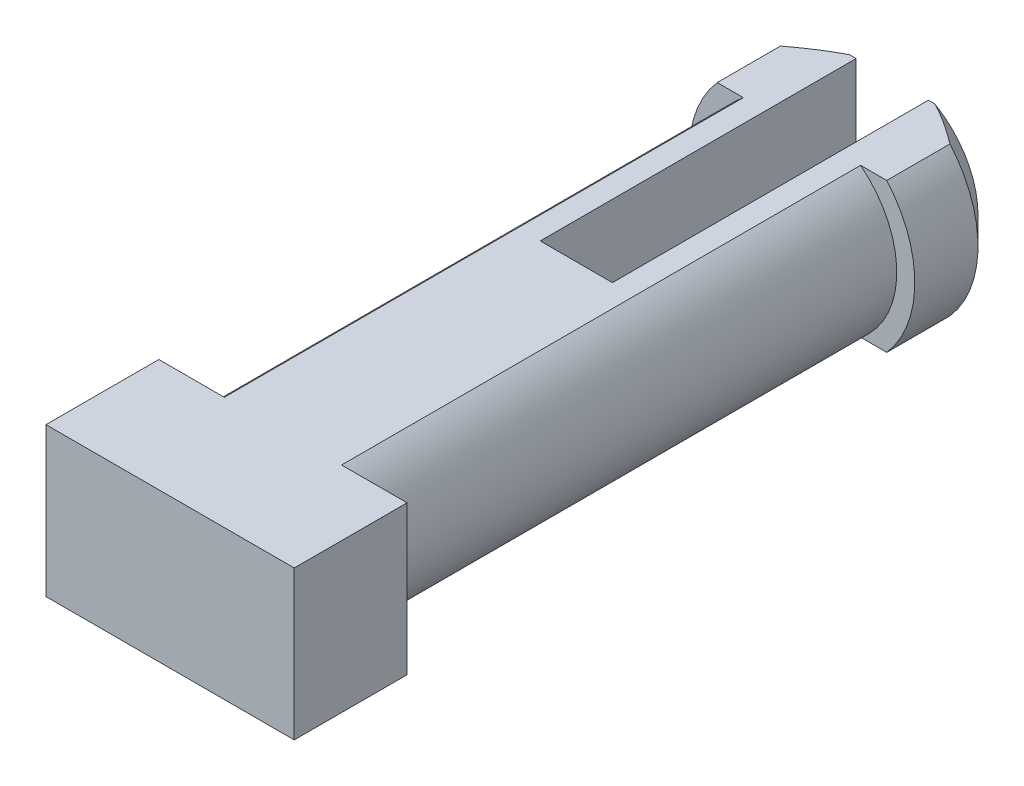
ISO-10303-21;
HEADER;
FILE_DESCRIPTION(('STEP AP214'),'2;1');
FILE_NAME('part.step','',(''),(''),'','','');
FILE_SCHEMA(('AUTOMOTIVE_DESIGN { 1 0 10303 214 1 1 1 1 }'));
ENDSEC;
DATA;
#1=APPLICATION_CONTEXT('core data for automotive mechanical design processes');
#2=APPLICATION_PROTOCOL_DEFINITION('international standard','automotive_design',2000,#1);
#3=PRODUCT_CONTEXT('',#1,'mechanical');
#4=PRODUCT('Part','Part','',(#3));
#5=PRODUCT_RELATED_PRODUCT_CATEGORY('part','',(#4));
#6=PRODUCT_DEFINITION_FORMATION('','',#4);
#7=PRODUCT_DEFINITION_CONTEXT('part definition',#1,'design');
#8=PRODUCT_DEFINITION('design','',#6,#7);
#9=PRODUCT_DEFINITION_SHAPE('','',#8);
#10=(LENGTH_UNIT() NAMED_UNIT(*) SI_UNIT(.MILLI.,.METRE.));
#11=(NAMED_UNIT(*) PLANE_ANGLE_UNIT() SI_UNIT($,.RADIAN.));
#12=(NAMED_UNIT(*) SI_UNIT($,.STERADIAN.) SOLID_ANGLE_UNIT());
#13=UNCERTAINTY_MEASURE_WITH_UNIT(LENGTH_MEASURE(1.E-05),#10,'distance_accuracy_value','');
#14=(GEOMETRIC_REPRESENTATION_CONTEXT(3) GLOBAL_UNCERTAINTY_ASSIGNED_CONTEXT((#13)) GLOBAL_UNIT_ASSIGNED_CONTEXT((#10,
#11,#12)) REPRESENTATION_CONTEXT('',''));
#15=CARTESIAN_POINT('',(0.,0.,0.));
#16=DIRECTION('',(0.,0.,1.));
#17=DIRECTION('',(1.,0.,0.));
#18=AXIS2_PLACEMENT_3D('',#15,#16,#17);
#19=CARTESIAN_POINT('',(-76.2353071822368,0.117725091031173,-31.5989637783194));
#20=DIRECTION('',(-1.,0.,0.));
#21=DIRECTION('',(0.,0.,1.));
#22=AXIS2_PLACEMENT_3D('',#19,#20,#21);
#23=PLANE('',#22);
#24=DIRECTION('',(0.,0.,1.));
#25=VECTOR('',#24,1.);
#26=CARTESIAN_POINT('',(-76.2353071822368,-0.572274908968824,-32.4989637783194));
#27=LINE('',#26,#25);
#28=CARTESIAN_POINT('',(-76.2353071822368,-0.572274908968825,-30.5389637783194));
#29=VERTEX_POINT('',#28);
#30=CARTESIAN_POINT('',(-76.2353071822368,-0.572274908968825,-23.5389637783194));
#31=VERTEX_POINT('',#30);
#32=EDGE_CURVE('E160',#29,#31,#27,.T.);
#33=ORIENTED_EDGE('',*,*,#32,.F.);
#34=DIRECTION('',(0.,1.,0.));
#35=VECTOR('',#34,1.);
#36=CARTESIAN_POINT('',(-76.2353071822368,-4.56227490896883,-30.5389637783194));
#37=LINE('',#36,#35);
#38=CARTESIAN_POINT('',(-76.2353071822368,-3.87227490896883,-30.5389637783194));
#39=VERTEX_POINT('',#38);
#40=EDGE_CURVE('E111',#39,#29,#37,.T.);
#41=ORIENTED_EDGE('',*,*,#40,.F.);
#42=DIRECTION('',(0.,0.,-1.));
#43=VECTOR('',#42,1.);
#44=CARTESIAN_POINT('',(-76.2353071822368,-3.87227490896883,-12.5789637783194));
#45=LINE('',#44,#43);
#46=CARTESIAN_POINT('',(-76.2353071822368,-3.87227490896883,-23.5389637783194));
#47=VERTEX_POINT('',#46);
#48=EDGE_CURVE('E224',#47,#39,#45,.T.);
#49=ORIENTED_EDGE('',*,*,#48,.F.);
#50=DIRECTION('',(0.,1.,0.));
#51=VECTOR('',#50,1.);
#52=CARTESIAN_POINT('',(-76.2353071822368,-4.56227490896883,-23.5389637783194));
#53=LINE('',#52,#51);
#54=EDGE_CURVE('E161',#31,#47,#53,.F.);
#55=ORIENTED_EDGE('',*,*,#54,.F.);
#56=EDGE_LOOP('',(#33,#41,#49,#55));
#57=FACE_BOUND('',#56,.T.);
#58=ADVANCED_FACE('F14',(#57),#23,.T.);
#59=CARTESIAN_POINT('',(-74.6653071822367,-4.56227490896883,-30.5389637783194));
#60=DIRECTION('',(0.,0.,-1.));
#61=DIRECTION('',(-1.,0.,0.));
#62=AXIS2_PLACEMENT_3D('',#59,#60,#61);
#63=PLANE('',#62);
#64=CARTESIAN_POINT('',(-76.0932349981659,-3.87227490896881,-30.5389637783194));
#65=CARTESIAN_POINT('',(-76.0468133293684,-3.84577094009665,-30.5389637783194));
#66=CARTESIAN_POINT('',(-76.0015318151991,-3.81731780875696,-30.5389637783194));
#67=CARTESIAN_POINT('',(-75.9135295388419,-3.75670340526783,-30.5389637783194));
#68=CARTESIAN_POINT('',(-75.870808516365,-3.72454251100924,-30.5389637783194));
#69=CARTESIAN_POINT('',(-75.7470230966809,-3.62288161568403,-30.5389637783194));
#70=CARTESIAN_POINT('',(-75.6701883036997,-3.54811866477146,-30.5389637783194));
#71=CARTESIAN_POINT('',(-75.5301420883078,-3.38670622232277,-30.5389637783194));
#72=CARTESIAN_POINT('',(-75.4669370356522,-3.3000512039427,-30.5389637783194));
#73=CARTESIAN_POINT('',(-75.3837616882182,-3.16315586717694,-30.5389637783194));
#74=CARTESIAN_POINT('',(-75.3579730666862,-3.11636639022587,-30.5389637783194));
#75=CARTESIAN_POINT('',(-75.3103987475018,-3.02073937405032,-30.5389637783194));
#76=CARTESIAN_POINT('',(-75.2886168659895,-2.97189993618704,-30.5389637783194));
#77=CARTESIAN_POINT('',(-75.2296000223762,-2.82294595944435,-30.5389637783194));
#78=CARTESIAN_POINT('',(-75.1986211410463,-2.72027580101289,-30.5389637783194));
#79=CARTESIAN_POINT('',(-75.1543623895121,-2.51117997230449,-30.5389637783194));
#80=CARTESIAN_POINT('',(-75.141083625662,-2.4047540676996,-30.5389637783194));
#81=CARTESIAN_POINT('',(-75.1346842083401,-2.24464346847721,-30.5389637783194));
#82=CARTESIAN_POINT('',(-75.1348094733314,-2.19115354372823,-30.5389637783194));
#83=CARTESIAN_POINT('',(-75.1395634106559,-2.08442694526944,-30.5389637783194));
#84=CARTESIAN_POINT('',(-75.1441866083597,-2.03119004274606,-30.5389637783194));
#85=CARTESIAN_POINT('',(-75.1579002357707,-1.92530206501404,-30.5389637783194));
#86=CARTESIAN_POINT('',(-75.1669900634881,-1.87265091183872,-30.5389637783194));
#87=CARTESIAN_POINT('',(-75.189577284845,-1.76824800295876,-30.5389637783194));
#88=CARTESIAN_POINT('',(-75.2030800508211,-1.71649742490929,-30.5389637783194));
#89=CARTESIAN_POINT('',(-75.2500512987537,-1.56330318814526,-30.5389637783194));
#90=CARTESIAN_POINT('',(-75.2900020741934,-1.463768784372,-30.5389637783194));
#91=CARTESIAN_POINT('',(-75.3860651518974,-1.27284376145886,-30.5389637783194));
#92=CARTESIAN_POINT('',(-75.4421757860486,-1.18145230303185,-30.5389637783194));
#93=CARTESIAN_POINT('',(-75.5372130189646,-1.052409262237,-30.5389637783194));
#94=CARTESIAN_POINT('',(-75.5707476911757,-1.01069337095264,-30.5389637783194));
#95=CARTESIAN_POINT('',(-75.6411959568207,-0.930258687226402,-30.5389637783194));
#96=CARTESIAN_POINT('',(-75.6781068701636,-0.891537561811588,-30.5389637783194));
#97=CARTESIAN_POINT('',(-75.7550092548121,-0.817394768855837,-30.5389637783194));
#98=CARTESIAN_POINT('',(-75.7949968127061,-0.781969032406077,-30.5389637783194));
#99=CARTESIAN_POINT('',(-75.8778040905174,-0.714616978685832,-30.5389637783194));
#100=CARTESIAN_POINT('',(-75.9206227879884,-0.68268940902575,-30.5389637783194));
#101=CARTESIAN_POINT('',(-75.9855906565279,-0.638376064807736,-30.5389637783194));
#102=CARTESIAN_POINT('',(-76.0067664237344,-0.624544131239821,-30.5389637783194));
#103=CARTESIAN_POINT('',(-76.0496228586669,-0.597755336286038,-30.5389637783194));
#104=CARTESIAN_POINT('',(-76.0713027715575,-0.584797267324398,-30.5389637783194));
#105=CARTESIAN_POINT('',(-76.0932349981659,-0.572274908968873,-30.5389637783194));
#106=B_SPLINE_CURVE_WITH_KNOTS('',3,(#64,#65,#66,#67,#68,#69,#70,#71,#72,#73,#74,#75,#76,#77,
#78,#79,#80,#81,#82,#83,#84,#85,#86,#87,#88,#89,#90,#91,#92,#93,#94,#95,#96,#97,#98,#99,#100,
#101,#102,#103,#104,#105),.UNSPECIFIED.,.F.,.F.,(4,2,2,2,2,2,2,2,2,2,2,2,2,2,2,2,2,2,2,2,4),(0.,
0.160270194330243,0.320524068526389,0.640526652391439,0.960678464461189,1.12078982801574,
1.28105290569564,1.60116363852675,1.92129437909333,2.0816052163079,2.24172117603199,
2.40181556206345,2.5621055785037,2.88224283248226,3.20234705189767,3.36275922013168,
3.5230451388629,3.68313044553553,3.8431582509936,3.91902017095026,3.99477501460227),.UNSPECIFIED.);
#107=CARTESIAN_POINT('',(-76.0932349981659,-3.87227490896882,-30.5389637783194));
#108=VERTEX_POINT('',#107);
#109=CARTESIAN_POINT('',(-76.0932349981659,-0.572274908968842,-30.5389637783194));
#110=VERTEX_POINT('',#109);
#111=EDGE_CURVE('E18',#108,#110,#106,.T.);
#112=ORIENTED_EDGE('',*,*,#111,.F.);
#113=DIRECTION('',(1.,0.,0.));
#114=VECTOR('',#113,1.);
#115=CARTESIAN_POINT('',(-80.6953071822368,-3.87227490896883,-30.5389637783194));
#116=LINE('',#115,#114);
#117=EDGE_CURVE('E227',#39,#108,#116,.T.);
#118=ORIENTED_EDGE('',*,*,#117,.F.);
#119=ORIENTED_EDGE('',*,*,#40,.T.);
#120=DIRECTION('',(1.,0.,0.));
#121=VECTOR('',#120,1.);
#122=CARTESIAN_POINT('',(-80.6953071822368,-0.572274908968824,-30.5389637783194));
#123=LINE('',#122,#121);
#124=EDGE_CURVE('E340',#110,#29,#123,.F.);
#125=ORIENTED_EDGE('',*,*,#124,.F.);
#126=EDGE_LOOP('',(#112,#118,#119,#125));
#127=FACE_BOUND('',#126,.T.);
#128=ADVANCED_FACE('F355',(#127),#63,.T.);
#129=CARTESIAN_POINT('',(-77.0353071822368,-2.22227490896883,-32.4389637783194));
#130=CARTESIAN_POINT('',(-77.0353071822368,-4.97347490896883,-29.6877637783194));
#131=CARTESIAN_POINT('',(-77.0353071822368,-2.22227490896883,-32.4389637783194));
#132=CARTESIAN_POINT('',(-74.2841071822368,-4.97347490896883,-29.6877637783194));
#133=CARTESIAN_POINT('',(-77.0353071822368,-2.22227490896883,-32.4389637783194));
#134=CARTESIAN_POINT('',(-74.2841071822368,-2.22227490896883,-29.6877637783194));
#135=CARTESIAN_POINT('',(-77.0353071822368,-2.22227490896883,-32.4389637783194));
#136=CARTESIAN_POINT('',(-74.2841071822368,0.528925091031176,-29.6877637783194));
#137=CARTESIAN_POINT('',(-77.0353071822368,-2.22227490896883,-32.4389637783194));
#138=CARTESIAN_POINT('',(-77.0353071822368,0.528925091031176,-29.6877637783194));
#139=CARTESIAN_POINT('',(-77.0353071822368,-2.22227490896883,-32.4389637783194));
#140=CARTESIAN_POINT('',(-79.7865071822368,0.528925091031176,-29.6877637783194));
#141=CARTESIAN_POINT('',(-77.0353071822368,-2.22227490896883,-32.4389637783194));
#142=CARTESIAN_POINT('',(-79.7865071822368,-2.22227490896883,-29.6877637783194));
#143=CARTESIAN_POINT('',(-77.0353071822368,-2.22227490896883,-32.4389637783194));
#144=CARTESIAN_POINT('',(-79.7865071822368,-4.97347490896883,-29.6877637783194));
#145=CARTESIAN_POINT('',(-77.0353071822368,-2.22227490896883,-32.4389637783194));
#146=CARTESIAN_POINT('',(-77.0353071822368,-4.97347490896883,-29.6877637783194));
#147=(BOUNDED_SURFACE() B_SPLINE_SURFACE(2,1,((#129,#130),(#131,#132),(#133,#134),(#135,#136),
(#137,#138),(#139,#140),(#141,#142),(#143,#144),(#145,#146)),.UNSPECIFIED.,.T.,.F.,
.F.) B_SPLINE_SURFACE_WITH_KNOTS((3,2,2,2,3),(2,2),(0.,1.5707963267949,3.14159265358979,
4.71238898038469,6.28318530717959),(0.,3.89078435280086),
.UNSPECIFIED.) GEOMETRIC_REPRESENTATION_ITEM() RATIONAL_B_SPLINE_SURFACE(((1.,1.),
(0.707106781186548,0.707106781186548),(1.,1.),(0.707106781186548,0.707106781186548),(1.,1.),
(0.707106781186548,0.707106781186548),(1.,1.),(0.707106781186548,0.707106781186548),(1.,1.))) REPRESENTATION_ITEM('') SURFACE());
#148=CARTESIAN_POINT('',(-76.0932349981659,-3.87227490896883,-30.5389637783194));
#149=CARTESIAN_POINT('',(-76.0377126906365,-3.87227490896883,-30.511409665987));
#150=CARTESIAN_POINT('',(-75.9829251164488,-3.87227490896883,-30.4824332634278));
#151=CARTESIAN_POINT('',(-75.8747643857159,-3.87227490896883,-30.4222039002672));
#152=CARTESIAN_POINT('',(-75.8213884660292,-3.87227490896883,-30.3909559181604));
#153=CARTESIAN_POINT('',(-75.7157930936579,-3.87227490896883,-30.3266493232658));
#154=CARTESIAN_POINT('',(-75.6635729583095,-3.87227490896883,-30.2935918216446));
#155=CARTESIAN_POINT('',(-75.560123205388,-3.87227490896883,-30.2260168799878));
#156=CARTESIAN_POINT('',(-75.5088931396419,-3.87227490896883,-30.1915001241887));
#157=CARTESIAN_POINT('',(-75.4072060696457,-3.87227490896883,-30.1212367620015));
#158=CARTESIAN_POINT('',(-75.3567499504416,-3.87227490896883,-30.0854888802171));
#159=CARTESIAN_POINT('',(-75.2564757432845,-3.87227490896883,-30.0129474419106));
#160=CARTESIAN_POINT('',(-75.206658757134,-3.87227490896883,-29.9761523603329));
#161=CARTESIAN_POINT('',(-75.1571431851375,-3.87227490896883,-29.9389637783194));
#162=B_SPLINE_CURVE_WITH_KNOTS('',3,(#148,#149,#150,#151,#152,#153,#154,#155,#156,#157,#158,
#159,#160,#161),.UNSPECIFIED.,.F.,.F.,(4,2,2,2,2,2,4),(0.,0.185892598539961,0.371389403618241,
0.556773551881311,0.742071718220588,0.927567989215806,1.11334982457747),.UNSPECIFIED.);
#163=CARTESIAN_POINT('',(-75.1571431851375,-3.87227490896883,-29.9389637783194));
#164=VERTEX_POINT('',#163);
#165=EDGE_CURVE('E269',#108,#164,#162,.T.);
#166=CARTESIAN_POINT('',(-75.1571431851375,-0.572274908968823,-29.9389637783194));
#167=CARTESIAN_POINT('',(-75.206658757134,-0.572274908968824,-29.9761523603329));
#168=CARTESIAN_POINT('',(-75.2564757432844,-0.572274908968824,-30.0129474419106));
#169=CARTESIAN_POINT('',(-75.3567499504416,-0.572274908968824,-30.0854888802171));
#170=CARTESIAN_POINT('',(-75.4072060696457,-0.572274908968824,-30.1212367620015));
#171=CARTESIAN_POINT('',(-75.5088931396419,-0.572274908968824,-30.1915001241887));
#172=CARTESIAN_POINT('',(-75.5601232053879,-0.572274908968824,-30.2260168799877));
#173=CARTESIAN_POINT('',(-75.6635729583095,-0.572274908968824,-30.2935918216446));
#174=CARTESIAN_POINT('',(-75.7157930936579,-0.572274908968824,-30.3266493232658));
#175=CARTESIAN_POINT('',(-75.8213884660292,-0.572274908968824,-30.3909559181603));
#176=CARTESIAN_POINT('',(-75.8747643857158,-0.572274908968824,-30.4222039002671));
#177=CARTESIAN_POINT('',(-75.9829251164488,-0.572274908968824,-30.4824332634278));
#178=CARTESIAN_POINT('',(-76.0377126906365,-0.572274908968824,-30.511409665987));
#179=CARTESIAN_POINT('',(-76.0932349981659,-0.572274908968825,-30.5389637783193));
#180=B_SPLINE_CURVE_WITH_KNOTS('',3,(#166,#167,#168,#169,#170,#171,#172,#173,#174,#175,#176,
#177,#178,#179),.UNSPECIFIED.,.F.,.F.,(4,2,2,2,2,2,4),(0.,0.185781835361663,0.371278106356883,
0.556576272696147,0.741960420959209,0.927457226037489,1.11334982457744),.UNSPECIFIED.);
#181=CARTESIAN_POINT('',(-75.1571431851375,-0.572274908968824,-29.9389637783194));
#182=VERTEX_POINT('',#181);
#183=EDGE_CURVE('E321',#182,#110,#180,.T.);
#184=CARTESIAN_POINT('',(-77.0353071822368,-2.22227490896883,-29.9389637783194));
#185=DIRECTION('',(0.,0.,1.));
#186=DIRECTION('',(0.,-1.,0.));
#187=AXIS2_PLACEMENT_3D('',#184,#185,#186);
#188=CIRCLE('',#187,2.5);
#189=EDGE_CURVE('E220',#164,#182,#188,.T.);
#190=ORIENTED_EDGE('',*,*,#165,.F.);
#191=ORIENTED_EDGE('',*,*,#111,.T.);
#192=ORIENTED_EDGE('',*,*,#183,.F.);
#193=ORIENTED_EDGE('',*,*,#189,.F.);
#194=EDGE_LOOP('',(#190,#191,#192,#193));
#195=FACE_BOUND('',#194,.T.);
#196=ADVANCED_FACE('F349',(#195),#147,.T.);
#197=CARTESIAN_POINT('',(-77.0353071822368,-2.22227490896883,-30.0801637783194));
#198=DIRECTION('',(0.,0.,1.));
#199=DIRECTION('',(1.,0.,0.));
#200=AXIS2_PLACEMENT_3D('',#197,#198,#199);
#201=CYLINDRICAL_SURFACE('',#200,2.5);
#202=DIRECTION('',(0.,0.,1.));
#203=VECTOR('',#202,1.);
#204=CARTESIAN_POINT('',(-75.1571431851375,-0.572274908968824,-32.4989637783194));
#205=LINE('',#204,#203);
#206=CARTESIAN_POINT('',(-75.1571431851375,-0.572274908968824,-28.5389637783194));
#207=VERTEX_POINT('',#206);
#208=EDGE_CURVE('E240',#207,#182,#205,.F.);
#209=ORIENTED_EDGE('',*,*,#208,.F.);
#210=CARTESIAN_POINT('',(-77.0353071822368,-2.22227490896883,-28.5389637783194));
#211=DIRECTION('',(0.,0.,1.));
#212=DIRECTION('',(1.,0.,0.));
#213=AXIS2_PLACEMENT_3D('',#210,#211,#212);
#214=CIRCLE('',#213,2.5);
#215=CARTESIAN_POINT('',(-75.1571431851375,-3.87227490896883,-28.5389637783194));
#216=VERTEX_POINT('',#215);
#217=EDGE_CURVE('E222',#216,#207,#214,.T.);
#218=ORIENTED_EDGE('',*,*,#217,.F.);
#219=DIRECTION('',(0.,0.,-1.));
#220=VECTOR('',#219,1.);
#221=CARTESIAN_POINT('',(-75.1571431851375,-3.87227490896883,-12.5789637783194));
#222=LINE('',#221,#220);
#223=EDGE_CURVE('E219',#164,#216,#222,.F.);
#224=ORIENTED_EDGE('',*,*,#223,.F.);
#225=ORIENTED_EDGE('',*,*,#189,.T.);
#226=EDGE_LOOP('',(#209,#218,#224,#225));
#227=FACE_BOUND('',#226,.T.);
#228=ADVANCED_FACE('F319',(#227),#201,.T.);
#229=CARTESIAN_POINT('',(-76.2991370585331,-4.56227490896883,-28.5389637783194));
#230=DIRECTION('',(0.,0.,1.));
#231=DIRECTION('',(1.,0.,0.));
#232=AXIS2_PLACEMENT_3D('',#229,#230,#231);
#233=PLANE('',#232);
#234=ORIENTED_EDGE('',*,*,#217,.T.);
#235=DIRECTION('',(1.,0.,0.));
#236=VECTOR('',#235,1.);
#237=CARTESIAN_POINT('',(-80.6953071822368,-0.572274908968824,-28.5389637783194));
#238=LINE('',#237,#236);
#239=CARTESIAN_POINT('',(-75.7362690765601,-0.572274908968824,-28.5389637783194));
#240=VERTEX_POINT('',#239);
#241=EDGE_CURVE('E237',#240,#207,#238,.T.);
#242=ORIENTED_EDGE('',*,*,#241,.F.);
#243=CARTESIAN_POINT('',(-77.0353071822368,-2.22227490896883,-28.5389637783194));
#244=DIRECTION('',(0.,0.,1.));
#245=DIRECTION('',(0.,-1.,0.));
#246=AXIS2_PLACEMENT_3D('',#243,#244,#245);
#247=CIRCLE('',#246,2.1);
#248=CARTESIAN_POINT('',(-75.7362690765601,-3.87227490896883,-28.5389637783194));
#249=VERTEX_POINT('',#248);
#250=EDGE_CURVE('E309',#249,#240,#247,.T.);
#251=ORIENTED_EDGE('',*,*,#250,.F.);
#252=DIRECTION('',(1.,0.,0.));
#253=VECTOR('',#252,1.);
#254=CARTESIAN_POINT('',(-80.6953071822368,-3.87227490896883,-28.5389637783194));
#255=LINE('',#254,#253);
#256=EDGE_CURVE('E216',#216,#249,#255,.F.);
#257=ORIENTED_EDGE('',*,*,#256,.F.);
#258=EDGE_LOOP('',(#234,#242,#251,#257));
#259=FACE_BOUND('',#258,.T.);
#260=ADVANCED_FACE('F314',(#259),#233,.T.);
#261=CARTESIAN_POINT('',(-77.0353071822368,-2.22227490896883,-29.6901637783194));
#262=DIRECTION('',(0.,0.,1.));
#263=DIRECTION('',(0.,-1.,0.));
#264=AXIS2_PLACEMENT_3D('',#261,#262,#263);
#265=CYLINDRICAL_SURFACE('',#264,2.1);
#266=ORIENTED_EDGE('',*,*,#250,.T.);
#267=DIRECTION('',(0.,0.,1.));
#268=VECTOR('',#267,1.);
#269=CARTESIAN_POINT('',(-75.7362690765601,-0.572274908968824,-32.4989637783194));
#270=LINE('',#269,#268);
#271=CARTESIAN_POINT('',(-75.7362690765601,-0.572274908968824,-17.0389637783194));
#272=VERTEX_POINT('',#271);
#273=EDGE_CURVE('E241',#272,#240,#270,.F.);
#274=ORIENTED_EDGE('',*,*,#273,.F.);
#275=CARTESIAN_POINT('',(-77.0353071822368,-2.22227490896881,-17.0389637783194));
#276=DIRECTION('',(0.,0.,1.));
#277=DIRECTION('',(0.,-1.,0.));
#278=AXIS2_PLACEMENT_3D('',#275,#276,#277);
#279=CIRCLE('',#278,2.1);
#280=CARTESIAN_POINT('',(-75.7362690765602,-3.87227490896883,-17.0389637783194));
#281=VERTEX_POINT('',#280);
#282=EDGE_CURVE('E210',#281,#272,#279,.T.);
#283=ORIENTED_EDGE('',*,*,#282,.F.);
#284=DIRECTION('',(0.,0.,-1.));
#285=VECTOR('',#284,1.);
#286=CARTESIAN_POINT('',(-75.7362690765601,-3.87227490896883,-12.5789637783194));
#287=LINE('',#286,#285);
#288=EDGE_CURVE('E213',#249,#281,#287,.F.);
#289=ORIENTED_EDGE('',*,*,#288,.F.);
#290=EDGE_LOOP('',(#266,#274,#283,#289));
#291=FACE_BOUND('',#290,.T.);
#292=ADVANCED_FACE('F326',(#291),#265,.T.);
#293=CARTESIAN_POINT('',(-73.7802109928045,-4.56227490896883,-17.0389637783194));
#294=DIRECTION('',(0.,0.,-1.));
#295=DIRECTION('',(-1.,0.,0.));
#296=AXIS2_PLACEMENT_3D('',#293,#294,#295);
#297=PLANE('',#296);
#298=DIRECTION('',(1.,0.,0.));
#299=VECTOR('',#298,1.);
#300=CARTESIAN_POINT('',(-80.6953071822368,-3.87227490896883,-17.0389637783194));
#301=LINE('',#300,#299);
#302=CARTESIAN_POINT('',(-74.2853071822368,-3.87227490896883,-17.0389637783194));
#303=VERTEX_POINT('',#302);
#304=EDGE_CURVE('E208',#281,#303,#301,.T.);
#305=ORIENTED_EDGE('',*,*,#304,.F.);
#306=ORIENTED_EDGE('',*,*,#282,.T.);
#307=DIRECTION('',(1.,0.,0.));
#308=VECTOR('',#307,1.);
#309=CARTESIAN_POINT('',(-80.6953071822368,-0.572274908968824,-17.0389637783194));
#310=LINE('',#309,#308);
#311=CARTESIAN_POINT('',(-74.2853071822368,-0.572274908968824,-17.0389637783194));
#312=VERTEX_POINT('',#311);
#313=EDGE_CURVE('E244',#312,#272,#310,.F.);
#314=ORIENTED_EDGE('',*,*,#313,.F.);
#315=DIRECTION('',(0.,1.,0.));
#316=VECTOR('',#315,1.);
#317=CARTESIAN_POINT('',(-74.2853071822368,-4.56227490896883,-17.0389637783194));
#318=LINE('',#317,#316);
#319=EDGE_CURVE('E205',#303,#312,#318,.T.);
#320=ORIENTED_EDGE('',*,*,#319,.F.);
#321=EDGE_LOOP('',(#305,#306,#314,#320));
#322=FACE_BOUND('',#321,.T.);
#323=ADVANCED_FACE('F373',(#322),#297,.T.);
#324=CARTESIAN_POINT('',(-74.2853071822368,-4.56227490896883,-17.6489637783194));
#325=DIRECTION('',(1.,0.,0.));
#326=DIRECTION('',(0.,0.,-1.));
#327=AXIS2_PLACEMENT_3D('',#324,#325,#326);
#328=PLANE('',#327);
#329=DIRECTION('',(0.,0.,1.));
#330=VECTOR('',#329,1.);
#331=CARTESIAN_POINT('',(-74.2853071822368,-0.572274908968824,-32.4989637783194));
#332=LINE('',#331,#330);
#333=CARTESIAN_POINT('',(-74.2853071822368,-0.572274908968824,-14.5389637783194));
#334=VERTEX_POINT('',#333);
#335=EDGE_CURVE('E247',#334,#312,#332,.F.);
#336=ORIENTED_EDGE('',*,*,#335,.F.);
#337=DIRECTION('',(0.,1.,0.));
#338=VECTOR('',#337,1.);
#339=CARTESIAN_POINT('',(-74.2853071822368,-4.56227490896882,-14.5389637783194));
#340=LINE('',#339,#338);
#341=CARTESIAN_POINT('',(-74.2853071822368,-3.87227490896883,-14.5389637783194));
#342=VERTEX_POINT('',#341);
#343=EDGE_CURVE('E200',#342,#334,#340,.T.);
#344=ORIENTED_EDGE('',*,*,#343,.F.);
#345=DIRECTION('',(0.,0.,-1.));
#346=VECTOR('',#345,1.);
#347=CARTESIAN_POINT('',(-74.2853071822368,-3.87227490896883,-12.5789637783194));
#348=LINE('',#347,#346);
#349=EDGE_CURVE('E203',#303,#342,#348,.F.);
#350=ORIENTED_EDGE('',*,*,#349,.F.);
#351=ORIENTED_EDGE('',*,*,#319,.T.);
#352=EDGE_LOOP('',(#336,#344,#350,#351));
#353=FACE_BOUND('',#352,.T.);
#354=ADVANCED_FACE('F400',(#353),#328,.T.);
#355=CARTESIAN_POINT('',(-80.6953071822368,-4.56227490896882,-14.5389637783194));
#356=DIRECTION('',(0.,0.,1.));
#357=DIRECTION('',(1.,0.,0.));
#358=AXIS2_PLACEMENT_3D('',#355,#356,#357);
#359=PLANE('',#358);
#360=DIRECTION('',(0.,1.,0.));
#361=VECTOR('',#360,1.);
#362=CARTESIAN_POINT('',(-79.7853071822368,0.117725091031175,-14.5389637783194));
#363=LINE('',#362,#361);
#364=CARTESIAN_POINT('',(-79.7853071822368,-3.87227490896883,-14.5389637783194));
#365=VERTEX_POINT('',#364);
#366=CARTESIAN_POINT('',(-79.7853071822368,-0.572274908968824,-14.5389637783194));
#367=VERTEX_POINT('',#366);
#368=EDGE_CURVE('E166',#365,#367,#363,.T.);
#369=ORIENTED_EDGE('',*,*,#368,.F.);
#370=DIRECTION('',(1.,0.,0.));
#371=VECTOR('',#370,1.);
#372=CARTESIAN_POINT('',(-80.6953071822368,-3.87227490896883,-14.5389637783194));
#373=LINE('',#372,#371);
#374=EDGE_CURVE('E198',#342,#365,#373,.F.);
#375=ORIENTED_EDGE('',*,*,#374,.F.);
#376=ORIENTED_EDGE('',*,*,#343,.T.);
#377=DIRECTION('',(1.,0.,0.));
#378=VECTOR('',#377,1.);
#379=CARTESIAN_POINT('',(-80.6953071822368,-0.572274908968824,-14.5389637783194));
#380=LINE('',#379,#378);
#381=EDGE_CURVE('E170',#367,#334,#380,.T.);
#382=ORIENTED_EDGE('',*,*,#381,.F.);
#383=EDGE_LOOP('',(#369,#375,#376,#382));
#384=FACE_BOUND('',#383,.T.);
#385=ADVANCED_FACE('F380',(#384),#359,.T.);
#386=CARTESIAN_POINT('',(-79.7853071822368,0.117725091031175,-17.6489637783194));
#387=DIRECTION('',(-1.,0.,0.));
#388=DIRECTION('',(0.,0.,1.));
#389=AXIS2_PLACEMENT_3D('',#386,#387,#388);
#390=PLANE('',#389);
#391=DIRECTION('',(0.,0.,-1.));
#392=VECTOR('',#391,1.);
#393=CARTESIAN_POINT('',(-79.7853071822368,-3.87227490896883,-12.5789637783194));
#394=LINE('',#393,#392);
#395=CARTESIAN_POINT('',(-79.7853071822368,-3.87227490896883,-17.0389637783194));
#396=VERTEX_POINT('',#395);
#397=EDGE_CURVE('E185',#365,#396,#394,.T.);
#398=ORIENTED_EDGE('',*,*,#397,.F.);
#399=ORIENTED_EDGE('',*,*,#368,.T.);
#400=DIRECTION('',(0.,0.,1.));
#401=VECTOR('',#400,1.);
#402=CARTESIAN_POINT('',(-79.7853071822368,-0.572274908968824,-32.4989637783194));
#403=LINE('',#402,#401);
#404=CARTESIAN_POINT('',(-79.7853071822368,-0.572274908968824,-17.0389637783194));
#405=VERTEX_POINT('',#404);
#406=EDGE_CURVE('E164',#405,#367,#403,.T.);
#407=ORIENTED_EDGE('',*,*,#406,.F.);
#408=DIRECTION('',(0.,1.,0.));
#409=VECTOR('',#408,1.);
#410=CARTESIAN_POINT('',(-79.7853071822368,-4.56227490896884,-17.0389637783194));
#411=LINE('',#410,#409);
#412=EDGE_CURVE('E149',#396,#405,#411,.T.);
#413=ORIENTED_EDGE('',*,*,#412,.F.);
#414=EDGE_LOOP('',(#398,#399,#407,#413));
#415=FACE_BOUND('',#414,.T.);
#416=ADVANCED_FACE('F165',(#415),#390,.T.);
#417=CARTESIAN_POINT('',(-77.0353071822368,-2.22227490896883,-30.0801637783194));
#418=DIRECTION('',(0.,0.,1.));
#419=DIRECTION('',(1.,0.,0.));
#420=AXIS2_PLACEMENT_3D('',#417,#418,#419);
#421=CYLINDRICAL_SURFACE('',#420,2.5);
#422=DIRECTION('',(0.,0.,-1.));
#423=VECTOR('',#422,1.);
#424=CARTESIAN_POINT('',(-78.9134711793361,-3.87227490896883,-12.5789637783194));
#425=LINE('',#424,#423);
#426=CARTESIAN_POINT('',(-78.9134711793361,-3.87227490896883,-28.5389637783194));
#427=VERTEX_POINT('',#426);
#428=CARTESIAN_POINT('',(-78.9134711793361,-3.87227490896883,-29.9389637783194));
#429=VERTEX_POINT('',#428);
#430=EDGE_CURVE('E268',#427,#429,#425,.T.);
#431=ORIENTED_EDGE('',*,*,#430,.F.);
#432=CARTESIAN_POINT('',(-77.0353071822368,-2.22227490896883,-28.5389637783194));
#433=DIRECTION('',(0.,0.,1.));
#434=DIRECTION('',(1.,0.,0.));
#435=AXIS2_PLACEMENT_3D('',#432,#433,#434);
#436=CIRCLE('',#435,2.5);
#437=CARTESIAN_POINT('',(-78.9134711793361,-0.572274908968817,-28.5389637783194));
#438=VERTEX_POINT('',#437);
#439=EDGE_CURVE('E228',#438,#427,#436,.T.);
#440=ORIENTED_EDGE('',*,*,#439,.F.);
#441=DIRECTION('',(0.,0.,1.));
#442=VECTOR('',#441,1.);
#443=CARTESIAN_POINT('',(-78.9134711793361,-0.572274908968824,-32.4989637783194));
#444=LINE('',#443,#442);
#445=CARTESIAN_POINT('',(-78.9134711793361,-0.572274908968824,-29.9389637783194));
#446=VERTEX_POINT('',#445);
#447=EDGE_CURVE('E177',#446,#438,#444,.T.);
#448=ORIENTED_EDGE('',*,*,#447,.F.);
#449=CARTESIAN_POINT('',(-77.0353071822368,-2.22227490896883,-29.9389637783194));
#450=DIRECTION('',(0.,0.,-1.));
#451=DIRECTION('',(0.,1.,0.));
#452=AXIS2_PLACEMENT_3D('',#449,#450,#451);
#453=CIRCLE('',#452,2.50000000000001);
#454=EDGE_CURVE('E195',#429,#446,#453,.T.);
#455=ORIENTED_EDGE('',*,*,#454,.F.);
#456=EDGE_LOOP('',(#431,#440,#448,#455));
#457=FACE_BOUND('',#456,.T.);
#458=ADVANCED_FACE('F285',(#457),#421,.T.);
#459=CARTESIAN_POINT('',(-77.0353071822368,-2.22227490896883,-32.4389637783194));
#460=CARTESIAN_POINT('',(-77.0353071822368,-4.97347490896883,-29.6877637783194));
#461=CARTESIAN_POINT('',(-77.0353071822368,-2.22227490896883,-32.4389637783194));
#462=CARTESIAN_POINT('',(-74.2841071822368,-4.97347490896883,-29.6877637783194));
#463=CARTESIAN_POINT('',(-77.0353071822368,-2.22227490896883,-32.4389637783194));
#464=CARTESIAN_POINT('',(-74.2841071822368,-2.22227490896883,-29.6877637783194));
#465=CARTESIAN_POINT('',(-77.0353071822368,-2.22227490896883,-32.4389637783194));
#466=CARTESIAN_POINT('',(-74.2841071822368,0.528925091031176,-29.6877637783194));
#467=CARTESIAN_POINT('',(-77.0353071822368,-2.22227490896883,-32.4389637783194));
#468=CARTESIAN_POINT('',(-77.0353071822368,0.528925091031176,-29.6877637783194));
#469=CARTESIAN_POINT('',(-77.0353071822368,-2.22227490896883,-32.4389637783194));
#470=CARTESIAN_POINT('',(-79.7865071822368,0.528925091031176,-29.6877637783194));
#471=CARTESIAN_POINT('',(-77.0353071822368,-2.22227490896883,-32.4389637783194));
#472=CARTESIAN_POINT('',(-79.7865071822368,-2.22227490896883,-29.6877637783194));
#473=CARTESIAN_POINT('',(-77.0353071822368,-2.22227490896883,-32.4389637783194));
#474=CARTESIAN_POINT('',(-79.7865071822368,-4.97347490896883,-29.6877637783194));
#475=CARTESIAN_POINT('',(-77.0353071822368,-2.22227490896883,-32.4389637783194));
#476=CARTESIAN_POINT('',(-77.0353071822368,-4.97347490896883,-29.6877637783194));
#477=(BOUNDED_SURFACE() B_SPLINE_SURFACE(2,1,((#459,#460),(#461,#462),(#463,#464),(#465,#466),
(#467,#468),(#469,#470),(#471,#472),(#473,#474),(#475,#476)),.UNSPECIFIED.,.T.,.F.,
.F.) B_SPLINE_SURFACE_WITH_KNOTS((3,2,2,2,3),(2,2),(0.,1.5707963267949,3.14159265358979,
4.71238898038469,6.28318530717959),(0.,3.89078435280086),
.UNSPECIFIED.) GEOMETRIC_REPRESENTATION_ITEM() RATIONAL_B_SPLINE_SURFACE(((1.,1.),
(0.707106781186548,0.707106781186548),(1.,1.),(0.707106781186548,0.707106781186548),(1.,1.),
(0.707106781186548,0.707106781186548),(1.,1.),(0.707106781186548,0.707106781186548),(1.,1.))) REPRESENTATION_ITEM('') SURFACE());
#478=CARTESIAN_POINT('',(-77.9773793663076,-0.572274908968824,-30.5389637783194));
#479=CARTESIAN_POINT('',(-78.032901673837,-0.572274908968824,-30.511409665987));
#480=CARTESIAN_POINT('',(-78.0876892480247,-0.572274908968824,-30.4824332634279));
#481=CARTESIAN_POINT('',(-78.1958499787577,-0.572274908968824,-30.4222039002672));
#482=CARTESIAN_POINT('',(-78.2492258984443,-0.572274908968824,-30.3909559181604));
#483=CARTESIAN_POINT('',(-78.3548212708156,-0.572274908968824,-30.3266493232658));
#484=CARTESIAN_POINT('',(-78.4070414061641,-0.572274908968824,-30.2935918216446));
#485=CARTESIAN_POINT('',(-78.5104911590856,-0.572274908968824,-30.2260168799878));
#486=CARTESIAN_POINT('',(-78.5617212248316,-0.572274908968824,-30.1915001241887));
#487=CARTESIAN_POINT('',(-78.6634082948279,-0.572274908968824,-30.1212367620016));
#488=CARTESIAN_POINT('',(-78.713864414032,-0.572274908968824,-30.0854888802171));
#489=CARTESIAN_POINT('',(-78.8141386211891,-0.572274908968824,-30.0129474419106));
#490=CARTESIAN_POINT('',(-78.8639556073396,-0.572274908968824,-29.9761523603329));
#491=CARTESIAN_POINT('',(-78.9134711793361,-0.572274908968824,-29.9389637783194));
#492=B_SPLINE_CURVE_WITH_KNOTS('',3,(#478,#479,#480,#481,#482,#483,#484,#485,#486,#487,#488,
#489,#490,#491),.UNSPECIFIED.,.F.,.F.,(4,2,2,2,2,2,4),(0.,0.185892598539983,0.371389403618259,
0.556773551881352,0.74207171822063,0.927567989215873,1.11334982457757),.UNSPECIFIED.);
#493=CARTESIAN_POINT('',(-77.9773793663076,-0.572274908968814,-30.5389637783194));
#494=VERTEX_POINT('',#493);
#495=EDGE_CURVE('E179',#494,#446,#492,.T.);
#496=CARTESIAN_POINT('',(-77.9773793663076,-3.87227490896885,-30.5389637783194));
#497=CARTESIAN_POINT('',(-78.0238010351051,-3.84577094009669,-30.5389637783194));
#498=CARTESIAN_POINT('',(-78.0690825492745,-3.817317808757,-30.5389637783194));
#499=CARTESIAN_POINT('',(-78.1570848256317,-3.75670340526787,-30.5389637783194));
#500=CARTESIAN_POINT('',(-78.1998058481086,-3.72454251100929,-30.5389637783194));
#501=CARTESIAN_POINT('',(-78.3235912677927,-3.62288161568409,-30.5389637783194));
#502=CARTESIAN_POINT('',(-78.4004260607739,-3.54811866477151,-30.5389637783194));
#503=CARTESIAN_POINT('',(-78.5404722761658,-3.38670622232281,-30.5389637783194));
#504=CARTESIAN_POINT('',(-78.6036773288214,-3.30005120394273,-30.5389637783194));
#505=CARTESIAN_POINT('',(-78.6868526762553,-3.16315586717696,-30.5389637783194));
#506=CARTESIAN_POINT('',(-78.7126412977874,-3.11636639022588,-30.5389637783194));
#507=CARTESIAN_POINT('',(-78.7602156169718,-3.02073937405034,-30.5389637783194));
#508=CARTESIAN_POINT('',(-78.7819974984841,-2.97189993618708,-30.5389637783194));
#509=CARTESIAN_POINT('',(-78.8410143420974,-2.8229459594444,-30.5389637783194));
#510=CARTESIAN_POINT('',(-78.8719932234273,-2.72027580101293,-30.5389637783194));
#511=CARTESIAN_POINT('',(-78.9162519749615,-2.51117997230453,-30.5389637783194));
#512=CARTESIAN_POINT('',(-78.9295307388116,-2.40475406769964,-30.5389637783194));
#513=CARTESIAN_POINT('',(-78.9359301561335,-2.24464346847726,-30.5389637783194));
#514=CARTESIAN_POINT('',(-78.9358048911422,-2.19115354372827,-30.5389637783194));
#515=CARTESIAN_POINT('',(-78.9310509538177,-2.08442694526949,-30.5389637783194));
#516=CARTESIAN_POINT('',(-78.9264277561139,-2.0311900427461,-30.5389637783194));
#517=CARTESIAN_POINT('',(-78.9127141287029,-1.92530206501407,-30.5389637783194));
#518=CARTESIAN_POINT('',(-78.9036243009855,-1.87265091183876,-30.5389637783194));
#519=CARTESIAN_POINT('',(-78.8810370796286,-1.7682480029588,-30.5389637783194));
#520=CARTESIAN_POINT('',(-78.8675343136525,-1.71649742490933,-30.5389637783194));
#521=CARTESIAN_POINT('',(-78.82056306572,-1.56330318814528,-30.5389637783194));
#522=CARTESIAN_POINT('',(-78.7806122902803,-1.46376878437202,-30.5389637783194));
#523=CARTESIAN_POINT('',(-78.6845492125763,-1.27284376145889,-30.5389637783194));
#524=CARTESIAN_POINT('',(-78.6284385784251,-1.18145230303188,-30.5389637783194));
#525=CARTESIAN_POINT('',(-78.5334013455091,-1.05240926223702,-30.5389637783194));
#526=CARTESIAN_POINT('',(-78.4998666732979,-1.01069337095266,-30.5389637783194));
#527=CARTESIAN_POINT('',(-78.4294184076529,-0.930258687226422,-30.5389637783194));
#528=CARTESIAN_POINT('',(-78.3925074943101,-0.891537561811615,-30.5389637783194));
#529=CARTESIAN_POINT('',(-78.3156051096615,-0.817394768855871,-30.5389637783194));
#530=CARTESIAN_POINT('',(-78.2756175517676,-0.781969032406112,-30.5389637783194));
#531=CARTESIAN_POINT('',(-78.1928102739562,-0.714616978685862,-30.5389637783194));
#532=CARTESIAN_POINT('',(-78.1499915764852,-0.682689409025775,-30.5389637783194));
#533=CARTESIAN_POINT('',(-78.0850237079457,-0.638376064807757,-30.5389637783194));
#534=CARTESIAN_POINT('',(-78.0638479407392,-0.624544131239835,-30.5389637783194));
#535=CARTESIAN_POINT('',(-78.0209915058066,-0.597755336286027,-30.5389637783194));
#536=CARTESIAN_POINT('',(-77.999311592916,-0.584797267324368,-30.5389637783194));
#537=CARTESIAN_POINT('',(-77.9773793663076,-0.572274908968811,-30.5389637783194));
#538=B_SPLINE_CURVE_WITH_KNOTS('',3,(#496,#497,#498,#499,#500,#501,#502,#503,#504,#505,#506,
#507,#508,#509,#510,#511,#512,#513,#514,#515,#516,#517,#518,#519,#520,#521,#522,#523,#524,#525,
#526,#527,#528,#529,#530,#531,#532,#533,#534,#535,#536,#537),.UNSPECIFIED.,.F.,.F.,(4,2,2,2,2,2,
2,2,2,2,2,2,2,2,2,2,2,2,2,2,4),(0.,0.160270194330275,0.320524068526426,0.640526652391502,
0.960678464461274,1.12078982801582,1.28105290569571,1.60116363852681,1.92129437909339,
2.08160521630797,2.24172117603205,2.40181556206353,2.56210557850377,2.88224283248233,
3.20234705189774,3.36275922013175,3.52304513886298,3.68313044553561,3.84315825099367,
3.91902017095041,3.99477501460249),.UNSPECIFIED.);
#539=CARTESIAN_POINT('',(-77.9773793663076,-3.87227490896884,-30.5389637783194));
#540=VERTEX_POINT('',#539);
#541=EDGE_CURVE('E194',#540,#494,#538,.T.);
#542=CARTESIAN_POINT('',(-78.9134711793361,-3.87227490896882,-29.9389637783194));
#543=CARTESIAN_POINT('',(-78.8639556073396,-3.87227490896883,-29.9761523603329));
#544=CARTESIAN_POINT('',(-78.8141386211892,-3.87227490896883,-30.0129474419106));
#545=CARTESIAN_POINT('',(-78.713864414032,-3.87227490896883,-30.0854888802171));
#546=CARTESIAN_POINT('',(-78.6634082948279,-3.87227490896883,-30.1212367620015));
#547=CARTESIAN_POINT('',(-78.5617212248317,-3.87227490896883,-30.1915001241887));
#548=CARTESIAN_POINT('',(-78.5104911590856,-3.87227490896883,-30.2260168799878));
#549=CARTESIAN_POINT('',(-78.4070414061641,-3.87227490896883,-30.2935918216446));
#550=CARTESIAN_POINT('',(-78.3548212708157,-3.87227490896883,-30.3266493232658));
#551=CARTESIAN_POINT('',(-78.2492258984444,-3.87227490896883,-30.3909559181604));
#552=CARTESIAN_POINT('',(-78.1958499787577,-3.87227490896883,-30.4222039002672));
#553=CARTESIAN_POINT('',(-78.0876892480247,-3.87227490896883,-30.4824332634279));
#554=CARTESIAN_POINT('',(-78.032901673837,-3.87227490896883,-30.511409665987));
#555=CARTESIAN_POINT('',(-77.9773793663076,-3.87227490896883,-30.5389637783194));
#556=B_SPLINE_CURVE_WITH_KNOTS('',3,(#542,#543,#544,#545,#546,#547,#548,#549,#550,#551,#552,
#553,#554,#555),.UNSPECIFIED.,.F.,.F.,(4,2,2,2,2,2,4),(0.,0.185781835361711,0.371278106356942,
0.556576272696229,0.741960420959332,0.927457226037624,1.1133498245776),.UNSPECIFIED.);
#557=EDGE_CURVE('E260',#429,#540,#556,.T.);
#558=ORIENTED_EDGE('',*,*,#495,.F.);
#559=ORIENTED_EDGE('',*,*,#541,.F.);
#560=ORIENTED_EDGE('',*,*,#557,.F.);
#561=ORIENTED_EDGE('',*,*,#454,.T.);
#562=EDGE_LOOP('',(#558,#559,#560,#561));
#563=FACE_BOUND('',#562,.T.);
#564=ADVANCED_FACE('F277',(#563),#477,.T.);
#565=CARTESIAN_POINT('',(-77.3653071822368,-4.56227490896883,-30.5389637783194));
#566=DIRECTION('',(0.,0.,-1.));
#567=DIRECTION('',(-1.,0.,0.));
#568=AXIS2_PLACEMENT_3D('',#565,#566,#567);
#569=PLANE('',#568);
#570=ORIENTED_EDGE('',*,*,#541,.T.);
#571=DIRECTION('',(1.,0.,0.));
#572=VECTOR('',#571,1.);
#573=CARTESIAN_POINT('',(-80.6953071822368,-0.572274908968824,-30.5389637783194));
#574=LINE('',#573,#572);
#575=CARTESIAN_POINT('',(-77.8353071822368,-0.572274908968825,-30.5389637783194));
#576=VERTEX_POINT('',#575);
#577=EDGE_CURVE('E183',#576,#494,#574,.F.);
#578=ORIENTED_EDGE('',*,*,#577,.F.);
#579=DIRECTION('',(0.,1.,0.));
#580=VECTOR('',#579,1.);
#581=CARTESIAN_POINT('',(-77.8353071822368,-4.56227490896883,-30.5389637783194));
#582=LINE('',#581,#580);
#583=CARTESIAN_POINT('',(-77.8353071822368,-3.87227490896883,-30.5389637783194));
#584=VERTEX_POINT('',#583);
#585=EDGE_CURVE('E191',#584,#576,#582,.T.);
#586=ORIENTED_EDGE('',*,*,#585,.F.);
#587=DIRECTION('',(1.,0.,0.));
#588=VECTOR('',#587,1.);
#589=CARTESIAN_POINT('',(-80.6953071822368,-3.87227490896883,-30.5389637783194));
#590=LINE('',#589,#588);
#591=EDGE_CURVE('E190',#540,#584,#590,.T.);
#592=ORIENTED_EDGE('',*,*,#591,.F.);
#593=EDGE_LOOP('',(#570,#578,#586,#592));
#594=FACE_BOUND('',#593,.T.);
#595=ADVANCED_FACE('F284',(#594),#569,.T.);
#596=CARTESIAN_POINT('',(-77.8353071822368,-4.56227490896883,-31.5989637783194));
#597=DIRECTION('',(1.,0.,0.));
#598=DIRECTION('',(0.,0.,-1.));
#599=AXIS2_PLACEMENT_3D('',#596,#597,#598);
#600=PLANE('',#599);
#601=DIRECTION('',(0.,0.,-1.));
#602=VECTOR('',#601,1.);
#603=CARTESIAN_POINT('',(-77.8353071822368,-3.87227490896883,-12.5789637783194));
#604=LINE('',#603,#602);
#605=CARTESIAN_POINT('',(-77.8353071822368,-3.87227490896883,-23.5389637783194));
#606=VERTEX_POINT('',#605);
#607=EDGE_CURVE('E186',#584,#606,#604,.F.);
#608=ORIENTED_EDGE('',*,*,#607,.F.);
#609=ORIENTED_EDGE('',*,*,#585,.T.);
#610=DIRECTION('',(0.,0.,1.));
#611=VECTOR('',#610,1.);
#612=CARTESIAN_POINT('',(-77.8353071822368,-0.572274908968824,-32.4989637783194));
#613=LINE('',#612,#611);
#614=CARTESIAN_POINT('',(-77.8353071822368,-0.572274908968825,-23.5389637783194));
#615=VERTEX_POINT('',#614);
#616=EDGE_CURVE('E251',#615,#576,#613,.F.);
#617=ORIENTED_EDGE('',*,*,#616,.F.);
#618=DIRECTION('',(0.,1.,0.));
#619=VECTOR('',#618,1.);
#620=CARTESIAN_POINT('',(-77.8353071822368,-4.56227490896883,-23.5389637783194));
#621=LINE('',#620,#619);
#622=EDGE_CURVE('E193',#606,#615,#621,.T.);
#623=ORIENTED_EDGE('',*,*,#622,.F.);
#624=EDGE_LOOP('',(#608,#609,#617,#623));
#625=FACE_BOUND('',#624,.T.);
#626=ADVANCED_FACE('F446',(#625),#600,.T.);
#627=CARTESIAN_POINT('',(-75.7153071822368,-4.56227490896883,-23.5389637783194));
#628=DIRECTION('',(0.,0.,-1.));
#629=DIRECTION('',(-1.,0.,0.));
#630=AXIS2_PLACEMENT_3D('',#627,#628,#629);
#631=PLANE('',#630);
#632=DIRECTION('',(1.,0.,0.));
#633=VECTOR('',#632,1.);
#634=CARTESIAN_POINT('',(-80.6953071822368,-0.572274908968824,-23.5389637783194));
#635=LINE('',#634,#633);
#636=EDGE_CURVE('E236',#31,#615,#635,.F.);
#637=ORIENTED_EDGE('',*,*,#636,.F.);
#638=ORIENTED_EDGE('',*,*,#54,.T.);
#639=DIRECTION('',(1.,0.,0.));
#640=VECTOR('',#639,1.);
#641=CARTESIAN_POINT('',(-80.6953071822368,-3.87227490896883,-23.5389637783194));
#642=LINE('',#641,#640);
#643=EDGE_CURVE('E189',#606,#47,#642,.T.);
#644=ORIENTED_EDGE('',*,*,#643,.F.);
#645=ORIENTED_EDGE('',*,*,#622,.T.);
#646=EDGE_LOOP('',(#637,#638,#644,#645));
#647=FACE_BOUND('',#646,.T.);
#648=ADVANCED_FACE('F456',(#647),#631,.T.);
#649=CARTESIAN_POINT('',(-77.8292490984811,-4.56227490896884,-17.0389637783194));
#650=DIRECTION('',(0.,0.,-1.));
#651=DIRECTION('',(-1.,0.,0.));
#652=AXIS2_PLACEMENT_3D('',#649,#650,#651);
#653=PLANE('',#652);
#654=DIRECTION('',(1.,0.,0.));
#655=VECTOR('',#654,1.);
#656=CARTESIAN_POINT('',(-80.6953071822368,-0.572274908968824,-17.0389637783194));
#657=LINE('',#656,#655);
#658=CARTESIAN_POINT('',(-78.3343452879135,-0.572274908968817,-17.0389637783194));
#659=VERTEX_POINT('',#658);
#660=EDGE_CURVE('E153',#659,#405,#657,.F.);
#661=ORIENTED_EDGE('',*,*,#660,.F.);
#662=CARTESIAN_POINT('',(-77.0353071822368,-2.22227490896881,-17.0389637783194));
#663=DIRECTION('',(0.,0.,1.));
#664=DIRECTION('',(0.,-1.,0.));
#665=AXIS2_PLACEMENT_3D('',#662,#663,#664);
#666=CIRCLE('',#665,2.1);
#667=CARTESIAN_POINT('',(-78.3343452879134,-3.87227490896884,-17.0389637783194));
#668=VERTEX_POINT('',#667);
#669=EDGE_CURVE('E233',#668,#659,#666,.F.);
#670=ORIENTED_EDGE('',*,*,#669,.F.);
#671=DIRECTION('',(1.,0.,0.));
#672=VECTOR('',#671,1.);
#673=CARTESIAN_POINT('',(-80.6953071822368,-3.87227490896883,-17.0389637783194));
#674=LINE('',#673,#672);
#675=EDGE_CURVE('E156',#396,#668,#674,.T.);
#676=ORIENTED_EDGE('',*,*,#675,.F.);
#677=ORIENTED_EDGE('',*,*,#412,.T.);
#678=EDGE_LOOP('',(#661,#670,#676,#677));
#679=FACE_BOUND('',#678,.T.);
#680=ADVANCED_FACE('F151',(#679),#653,.T.);
#681=CARTESIAN_POINT('',(-80.6953071822368,-0.572274908968824,-32.4989637783194));
#682=DIRECTION('',(0.,1.,0.));
#683=DIRECTION('',(0.,0.,1.));
#684=AXIS2_PLACEMENT_3D('',#681,#682,#683);
#685=PLANE('',#684);
#686=ORIENTED_EDGE('',*,*,#183,.T.);
#687=ORIENTED_EDGE('',*,*,#124,.T.);
#688=ORIENTED_EDGE('',*,*,#32,.T.);
#689=ORIENTED_EDGE('',*,*,#636,.T.);
#690=ORIENTED_EDGE('',*,*,#616,.T.);
#691=ORIENTED_EDGE('',*,*,#577,.T.);
#692=ORIENTED_EDGE('',*,*,#495,.T.);
#693=ORIENTED_EDGE('',*,*,#447,.T.);
#694=DIRECTION('',(1.,0.,0.));
#695=VECTOR('',#694,1.);
#696=CARTESIAN_POINT('',(-80.925893089616,-0.572274908968809,-28.5389637783194));
#697=LINE('',#696,#695);
#698=CARTESIAN_POINT('',(-78.3343452879134,-0.572274908968808,-28.5389637783194));
#699=VERTEX_POINT('',#698);
#700=EDGE_CURVE('E337',#699,#438,#697,.F.);
#701=ORIENTED_EDGE('',*,*,#700,.F.);
#702=DIRECTION('',(0.,0.,-1.));
#703=VECTOR('',#702,1.);
#704=CARTESIAN_POINT('',(-78.3343452879134,-0.572274908968808,-22.7889637783194));
#705=LINE('',#704,#703);
#706=EDGE_CURVE('E175',#659,#699,#705,.T.);
#707=ORIENTED_EDGE('',*,*,#706,.F.);
#708=ORIENTED_EDGE('',*,*,#660,.T.);
#709=ORIENTED_EDGE('',*,*,#406,.T.);
#710=ORIENTED_EDGE('',*,*,#381,.T.);
#711=ORIENTED_EDGE('',*,*,#335,.T.);
#712=ORIENTED_EDGE('',*,*,#313,.T.);
#713=ORIENTED_EDGE('',*,*,#273,.T.);
#714=ORIENTED_EDGE('',*,*,#241,.T.);
#715=ORIENTED_EDGE('',*,*,#208,.T.);
#716=EDGE_LOOP('',(#686,#687,#688,#689,#690,#691,#692,#693,#701,#707,#708,#709,#710,#711,#712,
#713,#714,#715));
#717=FACE_BOUND('',#716,.T.);
#718=ADVANCED_FACE('F173',(#717),#685,.T.);
#719=CARTESIAN_POINT('',(-80.925893089616,-4.56227490896884,-28.5389637783194));
#720=DIRECTION('',(0.,0.,1.));
#721=DIRECTION('',(1.,0.,0.));
#722=AXIS2_PLACEMENT_3D('',#719,#720,#721);
#723=PLANE('',#722);
#724=ORIENTED_EDGE('',*,*,#439,.T.);
#725=DIRECTION('',(1.,0.,0.));
#726=VECTOR('',#725,1.);
#727=CARTESIAN_POINT('',(-80.6953071822368,-3.87227490896883,-28.5389637783194));
#728=LINE('',#727,#726);
#729=CARTESIAN_POINT('',(-78.3343452879134,-3.87227490896884,-28.5389637783194));
#730=VERTEX_POINT('',#729);
#731=EDGE_CURVE('E38',#730,#427,#728,.F.);
#732=ORIENTED_EDGE('',*,*,#731,.F.);
#733=CARTESIAN_POINT('',(-77.0353071822368,-2.22227490896883,-28.5389637783194));
#734=DIRECTION('',(0.,0.,1.));
#735=DIRECTION('',(0.,-1.,0.));
#736=AXIS2_PLACEMENT_3D('',#733,#734,#735);
#737=CIRCLE('',#736,2.1);
#738=EDGE_CURVE('E29',#699,#730,#737,.T.);
#739=ORIENTED_EDGE('',*,*,#738,.F.);
#740=ORIENTED_EDGE('',*,*,#700,.T.);
#741=EDGE_LOOP('',(#724,#732,#739,#740));
#742=FACE_BOUND('',#741,.T.);
#743=ADVANCED_FACE('F387',(#742),#723,.T.);
#744=CARTESIAN_POINT('',(-80.6953071822368,-3.87227490896883,-12.5789637783194));
#745=DIRECTION('',(0.,-1.,0.));
#746=DIRECTION('',(0.,0.,-1.));
#747=AXIS2_PLACEMENT_3D('',#744,#745,#746);
#748=PLANE('',#747);
#749=ORIENTED_EDGE('',*,*,#607,.T.);
#750=ORIENTED_EDGE('',*,*,#643,.T.);
#751=ORIENTED_EDGE('',*,*,#48,.T.);
#752=ORIENTED_EDGE('',*,*,#117,.T.);
#753=ORIENTED_EDGE('',*,*,#165,.T.);
#754=ORIENTED_EDGE('',*,*,#223,.T.);
#755=ORIENTED_EDGE('',*,*,#256,.T.);
#756=ORIENTED_EDGE('',*,*,#288,.T.);
#757=ORIENTED_EDGE('',*,*,#304,.T.);
#758=ORIENTED_EDGE('',*,*,#349,.T.);
#759=ORIENTED_EDGE('',*,*,#374,.T.);
#760=ORIENTED_EDGE('',*,*,#397,.T.);
#761=ORIENTED_EDGE('',*,*,#675,.T.);
#762=DIRECTION('',(0.,0.,1.));
#763=VECTOR('',#762,1.);
#764=CARTESIAN_POINT('',(-78.3343452879134,-3.87227490896885,-22.7889637783194));
#765=LINE('',#764,#763);
#766=EDGE_CURVE('E9',#730,#668,#765,.T.);
#767=ORIENTED_EDGE('',*,*,#766,.F.);
#768=ORIENTED_EDGE('',*,*,#731,.T.);
#769=ORIENTED_EDGE('',*,*,#430,.T.);
#770=ORIENTED_EDGE('',*,*,#557,.T.);
#771=ORIENTED_EDGE('',*,*,#591,.T.);
#772=EDGE_LOOP('',(#749,#750,#751,#752,#753,#754,#755,#756,#757,#758,#759,#760,#761,#767,#768,
#769,#770,#771));
#773=FACE_BOUND('',#772,.T.);
#774=ADVANCED_FACE('F274',(#773),#748,.T.);
#775=CARTESIAN_POINT('',(-77.0353071822368,-2.22227490896883,-29.6901637783194));
#776=DIRECTION('',(0.,0.,1.));
#777=DIRECTION('',(0.,-1.,0.));
#778=AXIS2_PLACEMENT_3D('',#775,#776,#777);
#779=CYLINDRICAL_SURFACE('',#778,2.1);
#780=ORIENTED_EDGE('',*,*,#738,.T.);
#781=ORIENTED_EDGE('',*,*,#766,.T.);
#782=ORIENTED_EDGE('',*,*,#669,.T.);
#783=ORIENTED_EDGE('',*,*,#706,.T.);
#784=EDGE_LOOP('',(#780,#781,#782,#783));
#785=FACE_BOUND('',#784,.T.);
#786=ADVANCED_FACE('F16',(#785),#779,.T.);
#787=CLOSED_SHELL('',(#58,#128,#196,#228,#260,#292,#323,#354,#385,#416,#458,#564,#595,#626,#648,
#680,#718,#743,#774,#786));
#788=MANIFOLD_SOLID_BREP('B1',#787);
#789=ADVANCED_BREP_SHAPE_REPRESENTATION('',(#18,#788),#14);
#790=SHAPE_DEFINITION_REPRESENTATION(#9,#789);
ENDSEC;
END-ISO-10303-21;
